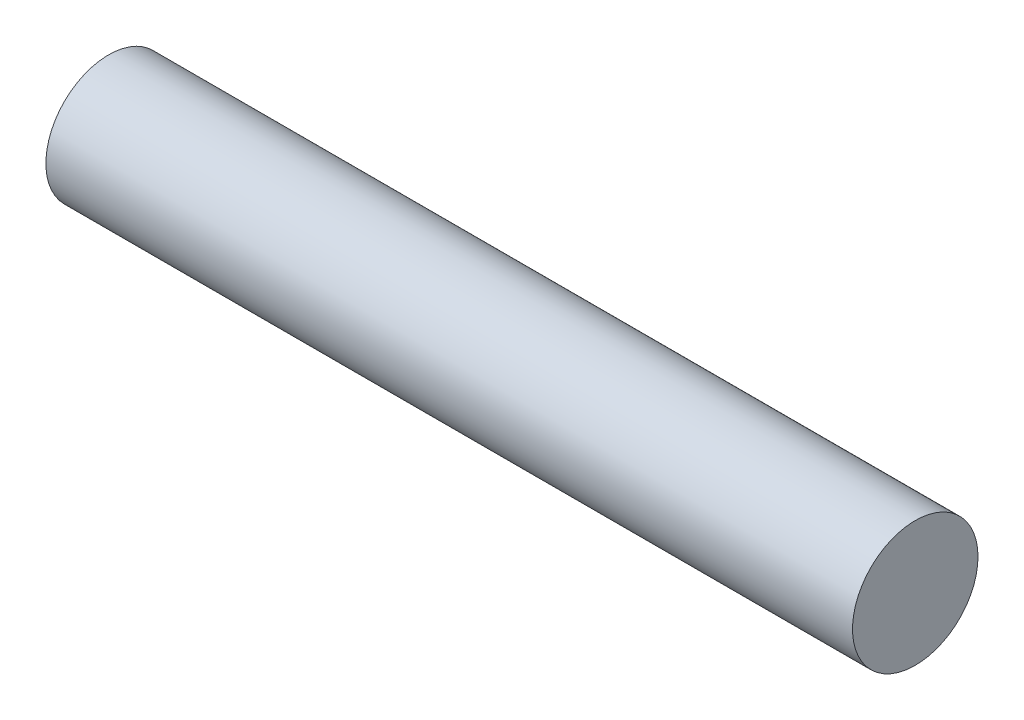
ISO-10303-21;
HEADER;
FILE_DESCRIPTION(('STEP AP214'),'2;1');
FILE_NAME('part.step','',(''),(''),'','','');
FILE_SCHEMA(('AUTOMOTIVE_DESIGN { 1 0 10303 214 1 1 1 1 }'));
ENDSEC;
DATA;
#1=APPLICATION_CONTEXT('core data for automotive mechanical design processes');
#2=APPLICATION_PROTOCOL_DEFINITION('international standard','automotive_design',2000,#1);
#3=PRODUCT_CONTEXT('',#1,'mechanical');
#4=PRODUCT('Part','Part','',(#3));
#5=PRODUCT_RELATED_PRODUCT_CATEGORY('part','',(#4));
#6=PRODUCT_DEFINITION_FORMATION('','',#4);
#7=PRODUCT_DEFINITION_CONTEXT('part definition',#1,'design');
#8=PRODUCT_DEFINITION('design','',#6,#7);
#9=PRODUCT_DEFINITION_SHAPE('','',#8);
#10=(LENGTH_UNIT() NAMED_UNIT(*) SI_UNIT(.MILLI.,.METRE.));
#11=(NAMED_UNIT(*) PLANE_ANGLE_UNIT() SI_UNIT($,.RADIAN.));
#12=(NAMED_UNIT(*) SI_UNIT($,.STERADIAN.) SOLID_ANGLE_UNIT());
#13=UNCERTAINTY_MEASURE_WITH_UNIT(LENGTH_MEASURE(1.E-05),#10,'distance_accuracy_value','');
#14=(GEOMETRIC_REPRESENTATION_CONTEXT(3) GLOBAL_UNCERTAINTY_ASSIGNED_CONTEXT((#13)) GLOBAL_UNIT_ASSIGNED_CONTEXT((#10,
#11,#12)) REPRESENTATION_CONTEXT('',''));
#15=CARTESIAN_POINT('',(0.,0.,0.));
#16=DIRECTION('',(0.,0.,1.));
#17=DIRECTION('',(1.,0.,0.));
#18=AXIS2_PLACEMENT_3D('',#15,#16,#17);
#19=CARTESIAN_POINT('',(22.86,0.,0.));
#20=DIRECTION('',(-1.,0.,0.));
#21=DIRECTION('',(0.,0.,1.));
#22=AXIS2_PLACEMENT_3D('',#19,#20,#21);
#23=CYLINDRICAL_SURFACE('',#22,3.556);
#24=CARTESIAN_POINT('',(22.86,0.,0.));
#25=DIRECTION('',(1.,0.,0.));
#26=DIRECTION('',(0.,0.,-1.));
#27=AXIS2_PLACEMENT_3D('',#24,#25,#26);
#28=CIRCLE('',#27,3.556);
#29=CARTESIAN_POINT('',(22.86,0.,-3.556));
#30=VERTEX_POINT('',#29);
#31=EDGE_CURVE('E10',#30,#30,#28,.T.);
#32=ORIENTED_EDGE('',*,*,#31,.F.);
#33=EDGE_LOOP('',(#32));
#34=FACE_BOUND('',#33,.T.);
#35=CARTESIAN_POINT('',(-22.86,0.,0.));
#36=DIRECTION('',(1.,0.,0.));
#37=DIRECTION('',(0.,0.,-1.));
#38=AXIS2_PLACEMENT_3D('',#35,#36,#37);
#39=CIRCLE('',#38,3.556);
#40=CARTESIAN_POINT('',(-22.86,0.,-3.556));
#41=VERTEX_POINT('',#40);
#42=EDGE_CURVE('E46',#41,#41,#39,.T.);
#43=ORIENTED_EDGE('',*,*,#42,.T.);
#44=EDGE_LOOP('',(#43));
#45=FACE_BOUND('',#44,.T.);
#46=ADVANCED_FACE('F43',(#34,#45),#23,.T.);
#47=CARTESIAN_POINT('',(22.86,0.,0.));
#48=DIRECTION('',(1.,0.,0.));
#49=DIRECTION('',(0.,0.,-1.));
#50=AXIS2_PLACEMENT_3D('',#47,#48,#49);
#51=PLANE('',#50);
#52=ORIENTED_EDGE('',*,*,#31,.T.);
#53=EDGE_LOOP('',(#52));
#54=FACE_BOUND('',#53,.T.);
#55=ADVANCED_FACE('F60',(#54),#51,.T.);
#56=CARTESIAN_POINT('',(-22.86,0.,0.));
#57=DIRECTION('',(1.,0.,0.));
#58=DIRECTION('',(0.,0.,-1.));
#59=AXIS2_PLACEMENT_3D('',#56,#57,#58);
#60=PLANE('',#59);
#61=ORIENTED_EDGE('',*,*,#42,.F.);
#62=EDGE_LOOP('',(#61));
#63=FACE_BOUND('',#62,.T.);
#64=ADVANCED_FACE('F58',(#63),#60,.F.);
#65=CLOSED_SHELL('',(#46,#55,#64));
#66=MANIFOLD_SOLID_BREP('B2',#65);
#67=ADVANCED_BREP_SHAPE_REPRESENTATION('',(#18,#66),#14);
#68=SHAPE_DEFINITION_REPRESENTATION(#9,#67);
ENDSEC;
END-ISO-10303-21;
